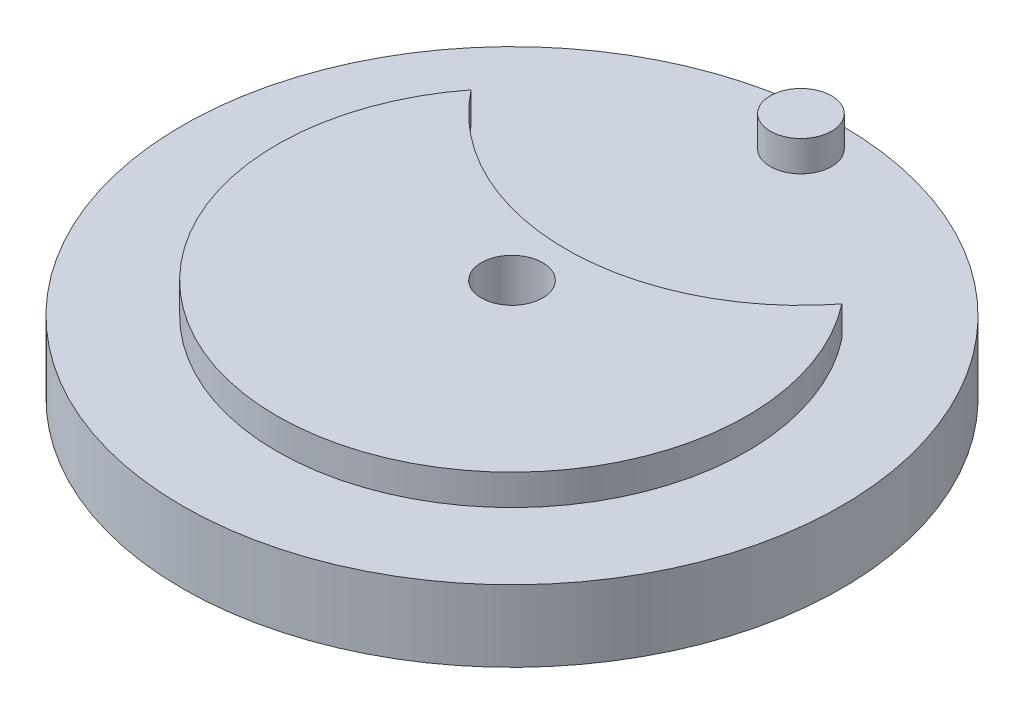
ISO-10303-21;
HEADER;
FILE_DESCRIPTION(('STEP AP214'),'2;1');
FILE_NAME('part.step','',(''),(''),'','','');
FILE_SCHEMA(('AUTOMOTIVE_DESIGN { 1 0 10303 214 1 1 1 1 }'));
ENDSEC;
DATA;
#1=APPLICATION_CONTEXT('core data for automotive mechanical design processes');
#2=APPLICATION_PROTOCOL_DEFINITION('international standard','automotive_design',2000,#1);
#3=PRODUCT_CONTEXT('',#1,'mechanical');
#4=PRODUCT('Part','Part','',(#3));
#5=PRODUCT_RELATED_PRODUCT_CATEGORY('part','',(#4));
#6=PRODUCT_DEFINITION_FORMATION('','',#4);
#7=PRODUCT_DEFINITION_CONTEXT('part definition',#1,'design');
#8=PRODUCT_DEFINITION('design','',#6,#7);
#9=PRODUCT_DEFINITION_SHAPE('','',#8);
#10=(LENGTH_UNIT() NAMED_UNIT(*) SI_UNIT(.MILLI.,.METRE.));
#11=(NAMED_UNIT(*) PLANE_ANGLE_UNIT() SI_UNIT($,.RADIAN.));
#12=(NAMED_UNIT(*) SI_UNIT($,.STERADIAN.) SOLID_ANGLE_UNIT());
#13=UNCERTAINTY_MEASURE_WITH_UNIT(LENGTH_MEASURE(1.E-05),#10,'distance_accuracy_value','');
#14=(GEOMETRIC_REPRESENTATION_CONTEXT(3) GLOBAL_UNCERTAINTY_ASSIGNED_CONTEXT((#13)) GLOBAL_UNIT_ASSIGNED_CONTEXT((#10,
#11,#12)) REPRESENTATION_CONTEXT('',''));
#15=CARTESIAN_POINT('',(0.,0.,0.));
#16=DIRECTION('',(0.,0.,1.));
#17=DIRECTION('',(1.,0.,0.));
#18=AXIS2_PLACEMENT_3D('',#15,#16,#17);
#19=CARTESIAN_POINT('',(0.,14.,0.));
#20=DIRECTION('',(0.,-1.,0.));
#21=DIRECTION('',(0.,0.,-1.));
#22=AXIS2_PLACEMENT_3D('',#19,#20,#21);
#23=CYLINDRICAL_SURFACE('',#22,64.5);
#24=CARTESIAN_POINT('',(0.,14.,0.));
#25=DIRECTION('',(0.,1.,0.));
#26=DIRECTION('',(0.,0.,1.));
#27=AXIS2_PLACEMENT_3D('',#24,#25,#26);
#28=CIRCLE('',#27,64.5);
#29=CARTESIAN_POINT('',(0.,14.,64.5));
#30=VERTEX_POINT('',#29);
#31=EDGE_CURVE('E81',#30,#30,#28,.T.);
#32=ORIENTED_EDGE('',*,*,#31,.F.);
#33=EDGE_LOOP('',(#32));
#34=FACE_BOUND('',#33,.T.);
#35=CARTESIAN_POINT('',(0.,0.,0.));
#36=DIRECTION('',(0.,1.,0.));
#37=DIRECTION('',(0.,0.,1.));
#38=AXIS2_PLACEMENT_3D('',#35,#36,#37);
#39=CIRCLE('',#38,64.5);
#40=CARTESIAN_POINT('',(0.,0.,64.5));
#41=VERTEX_POINT('',#40);
#42=EDGE_CURVE('E85',#41,#41,#39,.T.);
#43=ORIENTED_EDGE('',*,*,#42,.T.);
#44=EDGE_LOOP('',(#43));
#45=FACE_BOUND('',#44,.T.);
#46=ADVANCED_FACE('F43',(#34,#45),#23,.T.);
#47=CARTESIAN_POINT('',(0.,14.,0.));
#48=DIRECTION('',(0.,1.,0.));
#49=DIRECTION('',(0.,0.,1.));
#50=AXIS2_PLACEMENT_3D('',#47,#48,#49);
#51=PLANE('',#50);
#52=CARTESIAN_POINT('',(0.,14.,-56.55));
#53=DIRECTION('',(0.,1.,0.));
#54=DIRECTION('',(0.,0.,1.));
#55=AXIS2_PLACEMENT_3D('',#52,#53,#54);
#56=CIRCLE('',#55,6.);
#57=CARTESIAN_POINT('',(0.,14.,-50.55));
#58=VERTEX_POINT('',#57);
#59=EDGE_CURVE('E150',#58,#58,#56,.T.);
#60=ORIENTED_EDGE('',*,*,#59,.F.);
#61=EDGE_LOOP('',(#60));
#62=FACE_BOUND('',#61,.T.);
#63=ORIENTED_EDGE('',*,*,#31,.T.);
#64=EDGE_LOOP('',(#63));
#65=FACE_BOUND('',#64,.T.);
#66=CARTESIAN_POINT('',(0.,14.,-56.55));
#67=DIRECTION('',(0.,1.,0.));
#68=DIRECTION('',(0.,0.,1.));
#69=AXIS2_PLACEMENT_3D('',#66,#67,#68);
#70=CIRCLE('',#69,46.);
#71=CARTESIAN_POINT('',(36.2839410070075,14.,-28.275));
#72=VERTEX_POINT('',#71);
#73=CARTESIAN_POINT('',(-36.2839410070075,14.,-28.275));
#74=VERTEX_POINT('',#73);
#75=EDGE_CURVE('E66',#72,#74,#70,.F.);
#76=ORIENTED_EDGE('',*,*,#75,.F.);
#77=CARTESIAN_POINT('',(0.,14.,0.));
#78=DIRECTION('',(0.,1.,0.));
#79=DIRECTION('',(0.,0.,1.));
#80=AXIS2_PLACEMENT_3D('',#77,#78,#79);
#81=CIRCLE('',#80,46.);
#82=EDGE_CURVE('E51',#74,#72,#81,.T.);
#83=ORIENTED_EDGE('',*,*,#82,.F.);
#84=EDGE_LOOP('',(#76,#83));
#85=FACE_BOUND('',#84,.T.);
#86=ADVANCED_FACE('F80',(#62,#65,#85),#51,.T.);
#87=CARTESIAN_POINT('',(0.,0.,0.));
#88=DIRECTION('',(0.,1.,0.));
#89=DIRECTION('',(0.,0.,1.));
#90=AXIS2_PLACEMENT_3D('',#87,#88,#89);
#91=PLANE('',#90);
#92=CARTESIAN_POINT('',(0.,0.,0.));
#93=DIRECTION('',(0.,1.,0.));
#94=DIRECTION('',(0.,0.,1.));
#95=AXIS2_PLACEMENT_3D('',#92,#93,#94);
#96=CIRCLE('',#95,6.);
#97=CARTESIAN_POINT('',(0.,0.,6.));
#98=VERTEX_POINT('',#97);
#99=EDGE_CURVE('E153',#98,#98,#96,.T.);
#100=ORIENTED_EDGE('',*,*,#99,.T.);
#101=EDGE_LOOP('',(#100));
#102=FACE_BOUND('',#101,.T.);
#103=ORIENTED_EDGE('',*,*,#42,.F.);
#104=EDGE_LOOP('',(#103));
#105=FACE_BOUND('',#104,.T.);
#106=ADVANCED_FACE('F182',(#102,#105),#91,.F.);
#107=CARTESIAN_POINT('',(0.,20.,0.));
#108=DIRECTION('',(0.,-1.,0.));
#109=DIRECTION('',(0.,0.,-1.));
#110=AXIS2_PLACEMENT_3D('',#107,#108,#109);
#111=CYLINDRICAL_SURFACE('',#110,46.);
#112=ORIENTED_EDGE('',*,*,#82,.T.);
#113=DIRECTION('',(0.,1.,0.));
#114=VECTOR('',#113,1.);
#115=CARTESIAN_POINT('',(36.2839410070075,17.,-28.275));
#116=LINE('',#115,#114);
#117=CARTESIAN_POINT('',(36.2839410070075,20.,-28.275));
#118=VERTEX_POINT('',#117);
#119=EDGE_CURVE('E68',#72,#118,#116,.T.);
#120=ORIENTED_EDGE('',*,*,#119,.T.);
#121=CARTESIAN_POINT('',(0.,20.,0.));
#122=DIRECTION('',(0.,1.,0.));
#123=DIRECTION('',(0.,0.,1.));
#124=AXIS2_PLACEMENT_3D('',#121,#122,#123);
#125=CIRCLE('',#124,46.);
#126=CARTESIAN_POINT('',(-36.2839410070075,20.,-28.275));
#127=VERTEX_POINT('',#126);
#128=EDGE_CURVE('E78',#127,#118,#125,.T.);
#129=ORIENTED_EDGE('',*,*,#128,.F.);
#130=DIRECTION('',(0.,1.,0.));
#131=VECTOR('',#130,1.);
#132=CARTESIAN_POINT('',(-36.2839410070075,17.,-28.275));
#133=LINE('',#132,#131);
#134=EDGE_CURVE('E57',#127,#74,#133,.F.);
#135=ORIENTED_EDGE('',*,*,#134,.T.);
#136=EDGE_LOOP('',(#112,#120,#129,#135));
#137=FACE_BOUND('',#136,.T.);
#138=ADVANCED_FACE('F76',(#137),#111,.T.);
#139=CARTESIAN_POINT('',(0.,20.,0.));
#140=DIRECTION('',(0.,1.,0.));
#141=DIRECTION('',(0.,0.,1.));
#142=AXIS2_PLACEMENT_3D('',#139,#140,#141);
#143=PLANE('',#142);
#144=CARTESIAN_POINT('',(0.,20.,0.));
#145=DIRECTION('',(0.,1.,0.));
#146=DIRECTION('',(0.,0.,1.));
#147=AXIS2_PLACEMENT_3D('',#144,#145,#146);
#148=CIRCLE('',#147,6.);
#149=CARTESIAN_POINT('',(0.,20.,6.));
#150=VERTEX_POINT('',#149);
#151=EDGE_CURVE('E169',#150,#150,#148,.T.);
#152=ORIENTED_EDGE('',*,*,#151,.F.);
#153=EDGE_LOOP('',(#152));
#154=FACE_BOUND('',#153,.T.);
#155=CARTESIAN_POINT('',(0.,20.,-56.55));
#156=DIRECTION('',(0.,1.,0.));
#157=DIRECTION('',(0.,0.,1.));
#158=AXIS2_PLACEMENT_3D('',#155,#156,#157);
#159=CIRCLE('',#158,46.);
#160=EDGE_CURVE('E12',#127,#118,#159,.T.);
#161=ORIENTED_EDGE('',*,*,#160,.F.);
#162=ORIENTED_EDGE('',*,*,#128,.T.);
#163=EDGE_LOOP('',(#161,#162));
#164=FACE_BOUND('',#163,.T.);
#165=ADVANCED_FACE('F192',(#154,#164),#143,.T.);
#166=CARTESIAN_POINT('',(0.,-116.107647738325,-56.55));
#167=DIRECTION('',(0.,1.,0.));
#168=DIRECTION('',(0.,0.,1.));
#169=AXIS2_PLACEMENT_3D('',#166,#167,#168);
#170=CYLINDRICAL_SURFACE('',#169,46.);
#171=ORIENTED_EDGE('',*,*,#75,.T.);
#172=ORIENTED_EDGE('',*,*,#134,.F.);
#173=ORIENTED_EDGE('',*,*,#160,.T.);
#174=ORIENTED_EDGE('',*,*,#119,.F.);
#175=EDGE_LOOP('',(#171,#172,#173,#174));
#176=FACE_BOUND('',#175,.T.);
#177=ADVANCED_FACE('F67',(#176),#170,.F.);
#178=CARTESIAN_POINT('',(0.,20.,-56.55));
#179=DIRECTION('',(0.,-1.,0.));
#180=DIRECTION('',(0.,0.,-1.));
#181=AXIS2_PLACEMENT_3D('',#178,#179,#180);
#182=CYLINDRICAL_SURFACE('',#181,6.);
#183=CARTESIAN_POINT('',(0.,20.,-56.55));
#184=DIRECTION('',(0.,1.,0.));
#185=DIRECTION('',(0.,0.,1.));
#186=AXIS2_PLACEMENT_3D('',#183,#184,#185);
#187=CIRCLE('',#186,6.);
#188=CARTESIAN_POINT('',(0.,20.,-50.55));
#189=VERTEX_POINT('',#188);
#190=EDGE_CURVE('E72',#189,#189,#187,.T.);
#191=ORIENTED_EDGE('',*,*,#190,.F.);
#192=EDGE_LOOP('',(#191));
#193=FACE_BOUND('',#192,.T.);
#194=ORIENTED_EDGE('',*,*,#59,.T.);
#195=EDGE_LOOP('',(#194));
#196=FACE_BOUND('',#195,.T.);
#197=ADVANCED_FACE('F200',(#193,#196),#182,.T.);
#198=CARTESIAN_POINT('',(0.,20.,-56.55));
#199=DIRECTION('',(0.,1.,0.));
#200=DIRECTION('',(0.,0.,1.));
#201=AXIS2_PLACEMENT_3D('',#198,#199,#200);
#202=PLANE('',#201);
#203=ORIENTED_EDGE('',*,*,#190,.T.);
#204=EDGE_LOOP('',(#203));
#205=FACE_BOUND('',#204,.T.);
#206=ADVANCED_FACE('F188',(#205),#202,.T.);
#207=CARTESIAN_POINT('',(0.,0.,0.));
#208=DIRECTION('',(0.,1.,0.));
#209=DIRECTION('',(0.,0.,1.));
#210=AXIS2_PLACEMENT_3D('',#207,#208,#209);
#211=CYLINDRICAL_SURFACE('',#210,6.);
#212=ORIENTED_EDGE('',*,*,#99,.F.);
#213=EDGE_LOOP('',(#212));
#214=FACE_BOUND('',#213,.T.);
#215=ORIENTED_EDGE('',*,*,#151,.T.);
#216=EDGE_LOOP('',(#215));
#217=FACE_BOUND('',#216,.T.);
#218=ADVANCED_FACE('F185',(#214,#217),#211,.F.);
#219=CLOSED_SHELL('',(#46,#86,#106,#138,#165,#177,#197,#206,#218));
#220=MANIFOLD_SOLID_BREP('B2',#219);
#221=ADVANCED_BREP_SHAPE_REPRESENTATION('',(#18,#220),#14);
#222=SHAPE_DEFINITION_REPRESENTATION(#9,#221);
ENDSEC;
END-ISO-10303-21;
